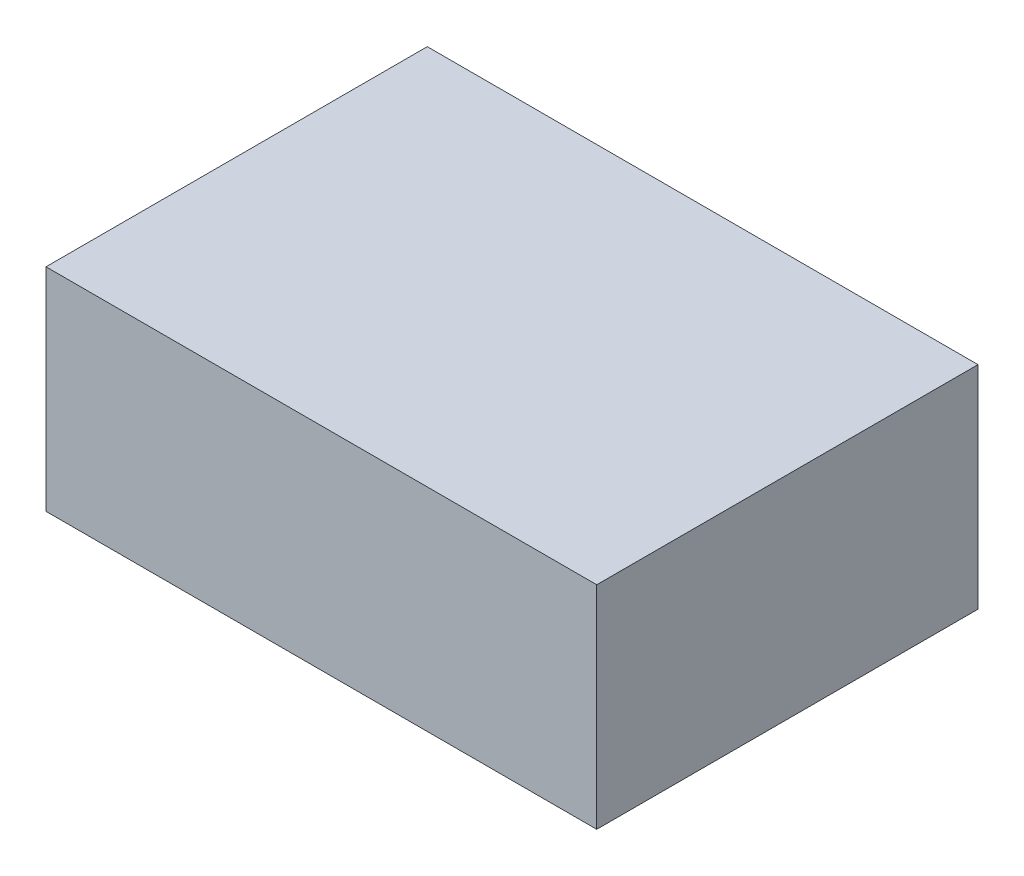
ISO-10303-21;
HEADER;
FILE_DESCRIPTION(('STEP AP214'),'2;1');
FILE_NAME('part.step','',(''),(''),'','','');
FILE_SCHEMA(('AUTOMOTIVE_DESIGN { 1 0 10303 214 1 1 1 1 }'));
ENDSEC;
DATA;
#1=APPLICATION_CONTEXT('core data for automotive mechanical design processes');
#2=APPLICATION_PROTOCOL_DEFINITION('international standard','automotive_design',2000,#1);
#3=PRODUCT_CONTEXT('',#1,'mechanical');
#4=PRODUCT('Part','Part','',(#3));
#5=PRODUCT_RELATED_PRODUCT_CATEGORY('part','',(#4));
#6=PRODUCT_DEFINITION_FORMATION('','',#4);
#7=PRODUCT_DEFINITION_CONTEXT('part definition',#1,'design');
#8=PRODUCT_DEFINITION('design','',#6,#7);
#9=PRODUCT_DEFINITION_SHAPE('','',#8);
#10=(LENGTH_UNIT() NAMED_UNIT(*) SI_UNIT(.MILLI.,.METRE.));
#11=(NAMED_UNIT(*) PLANE_ANGLE_UNIT() SI_UNIT($,.RADIAN.));
#12=(NAMED_UNIT(*) SI_UNIT($,.STERADIAN.) SOLID_ANGLE_UNIT());
#13=UNCERTAINTY_MEASURE_WITH_UNIT(LENGTH_MEASURE(1.E-05),#10,'distance_accuracy_value','');
#14=(GEOMETRIC_REPRESENTATION_CONTEXT(3) GLOBAL_UNCERTAINTY_ASSIGNED_CONTEXT((#13)) GLOBAL_UNIT_ASSIGNED_CONTEXT((#10,
#11,#12)) REPRESENTATION_CONTEXT('',''));
#15=CARTESIAN_POINT('',(0.,0.,0.));
#16=DIRECTION('',(0.,0.,1.));
#17=DIRECTION('',(1.,0.,0.));
#18=AXIS2_PLACEMENT_3D('',#15,#16,#17);
#19=CARTESIAN_POINT('',(-32.5,25.,22.5));
#20=DIRECTION('',(1.,0.,0.));
#21=DIRECTION('',(0.,0.,-1.));
#22=AXIS2_PLACEMENT_3D('',#19,#20,#21);
#23=PLANE('',#22);
#24=DIRECTION('',(0.,0.,1.));
#25=VECTOR('',#24,1.);
#26=CARTESIAN_POINT('',(-32.5,0.,22.5));
#27=LINE('',#26,#25);
#28=CARTESIAN_POINT('',(-32.5,0.,-22.5));
#29=VERTEX_POINT('',#28);
#30=CARTESIAN_POINT('',(-32.5,0.,22.5));
#31=VERTEX_POINT('',#30);
#32=EDGE_CURVE('E103',#29,#31,#27,.T.);
#33=ORIENTED_EDGE('',*,*,#32,.T.);
#34=DIRECTION('',(0.,-1.,0.));
#35=VECTOR('',#34,1.);
#36=CARTESIAN_POINT('',(-32.5,25.,22.5));
#37=LINE('',#36,#35);
#38=CARTESIAN_POINT('',(-32.5,25.,22.5));
#39=VERTEX_POINT('',#38);
#40=EDGE_CURVE('E11',#39,#31,#37,.T.);
#41=ORIENTED_EDGE('',*,*,#40,.F.);
#42=DIRECTION('',(0.,0.,1.));
#43=VECTOR('',#42,1.);
#44=CARTESIAN_POINT('',(-32.5,25.,22.5));
#45=LINE('',#44,#43);
#46=CARTESIAN_POINT('',(-32.5,25.,-22.5));
#47=VERTEX_POINT('',#46);
#48=EDGE_CURVE('E91',#47,#39,#45,.T.);
#49=ORIENTED_EDGE('',*,*,#48,.F.);
#50=DIRECTION('',(0.,-1.,0.));
#51=VECTOR('',#50,1.);
#52=CARTESIAN_POINT('',(-32.5,25.,-22.5));
#53=LINE('',#52,#51);
#54=EDGE_CURVE('E99',#47,#29,#53,.T.);
#55=ORIENTED_EDGE('',*,*,#54,.T.);
#56=EDGE_LOOP('',(#33,#41,#49,#55));
#57=FACE_BOUND('',#56,.T.);
#58=ADVANCED_FACE('F40',(#57),#23,.F.);
#59=CARTESIAN_POINT('',(32.5,25.,22.5));
#60=DIRECTION('',(0.,0.,-1.));
#61=DIRECTION('',(-1.,0.,0.));
#62=AXIS2_PLACEMENT_3D('',#59,#60,#61);
#63=PLANE('',#62);
#64=DIRECTION('',(1.,0.,0.));
#65=VECTOR('',#64,1.);
#66=CARTESIAN_POINT('',(32.5,0.,22.5));
#67=LINE('',#66,#65);
#68=CARTESIAN_POINT('',(32.5,0.,22.5));
#69=VERTEX_POINT('',#68);
#70=EDGE_CURVE('E95',#31,#69,#67,.T.);
#71=ORIENTED_EDGE('',*,*,#70,.T.);
#72=DIRECTION('',(0.,-1.,0.));
#73=VECTOR('',#72,1.);
#74=CARTESIAN_POINT('',(32.5,25.,22.5));
#75=LINE('',#74,#73);
#76=CARTESIAN_POINT('',(32.5,25.,22.5));
#77=VERTEX_POINT('',#76);
#78=EDGE_CURVE('E48',#77,#69,#75,.T.);
#79=ORIENTED_EDGE('',*,*,#78,.F.);
#80=DIRECTION('',(1.,0.,0.));
#81=VECTOR('',#80,1.);
#82=CARTESIAN_POINT('',(32.5,25.,22.5));
#83=LINE('',#82,#81);
#84=EDGE_CURVE('E86',#39,#77,#83,.T.);
#85=ORIENTED_EDGE('',*,*,#84,.F.);
#86=ORIENTED_EDGE('',*,*,#40,.T.);
#87=EDGE_LOOP('',(#71,#79,#85,#86));
#88=FACE_BOUND('',#87,.T.);
#89=ADVANCED_FACE('F94',(#88),#63,.F.);
#90=CARTESIAN_POINT('',(32.5,25.,22.5));
#91=DIRECTION('',(-1.,0.,0.));
#92=DIRECTION('',(0.,0.,1.));
#93=AXIS2_PLACEMENT_3D('',#90,#91,#92);
#94=PLANE('',#93);
#95=DIRECTION('',(0.,0.,-1.));
#96=VECTOR('',#95,1.);
#97=CARTESIAN_POINT('',(32.5,0.,22.5));
#98=LINE('',#97,#96);
#99=CARTESIAN_POINT('',(32.5,0.,-22.5));
#100=VERTEX_POINT('',#99);
#101=EDGE_CURVE('E73',#69,#100,#98,.T.);
#102=ORIENTED_EDGE('',*,*,#101,.T.);
#103=DIRECTION('',(0.,-1.,0.));
#104=VECTOR('',#103,1.);
#105=CARTESIAN_POINT('',(32.5,25.,-22.5));
#106=LINE('',#105,#104);
#107=CARTESIAN_POINT('',(32.5,25.,-22.5));
#108=VERTEX_POINT('',#107);
#109=EDGE_CURVE('E96',#108,#100,#106,.T.);
#110=ORIENTED_EDGE('',*,*,#109,.F.);
#111=DIRECTION('',(0.,0.,-1.));
#112=VECTOR('',#111,1.);
#113=CARTESIAN_POINT('',(32.5,25.,22.5));
#114=LINE('',#113,#112);
#115=EDGE_CURVE('E89',#77,#108,#114,.T.);
#116=ORIENTED_EDGE('',*,*,#115,.F.);
#117=ORIENTED_EDGE('',*,*,#78,.T.);
#118=EDGE_LOOP('',(#102,#110,#116,#117));
#119=FACE_BOUND('',#118,.T.);
#120=ADVANCED_FACE('F97',(#119),#94,.F.);
#121=CARTESIAN_POINT('',(32.5,25.,-22.5));
#122=DIRECTION('',(0.,0.,1.));
#123=DIRECTION('',(1.,0.,0.));
#124=AXIS2_PLACEMENT_3D('',#121,#122,#123);
#125=PLANE('',#124);
#126=DIRECTION('',(-1.,0.,0.));
#127=VECTOR('',#126,1.);
#128=CARTESIAN_POINT('',(32.5,0.,-22.5));
#129=LINE('',#128,#127);
#130=EDGE_CURVE('E79',#100,#29,#129,.T.);
#131=ORIENTED_EDGE('',*,*,#130,.T.);
#132=ORIENTED_EDGE('',*,*,#54,.F.);
#133=DIRECTION('',(-1.,0.,0.));
#134=VECTOR('',#133,1.);
#135=CARTESIAN_POINT('',(32.5,25.,-22.5));
#136=LINE('',#135,#134);
#137=EDGE_CURVE('E56',#108,#47,#136,.T.);
#138=ORIENTED_EDGE('',*,*,#137,.F.);
#139=ORIENTED_EDGE('',*,*,#109,.T.);
#140=EDGE_LOOP('',(#131,#132,#138,#139));
#141=FACE_BOUND('',#140,.T.);
#142=ADVANCED_FACE('F111',(#141),#125,.F.);
#143=CARTESIAN_POINT('',(0.,25.,0.));
#144=DIRECTION('',(0.,1.,0.));
#145=DIRECTION('',(0.,0.,1.));
#146=AXIS2_PLACEMENT_3D('',#143,#144,#145);
#147=PLANE('',#146);
#148=ORIENTED_EDGE('',*,*,#48,.T.);
#149=ORIENTED_EDGE('',*,*,#84,.T.);
#150=ORIENTED_EDGE('',*,*,#115,.T.);
#151=ORIENTED_EDGE('',*,*,#137,.T.);
#152=EDGE_LOOP('',(#148,#149,#150,#151));
#153=FACE_BOUND('',#152,.T.);
#154=ADVANCED_FACE('F87',(#153),#147,.T.);
#155=CARTESIAN_POINT('',(0.,0.,0.));
#156=DIRECTION('',(0.,1.,0.));
#157=DIRECTION('',(0.,0.,1.));
#158=AXIS2_PLACEMENT_3D('',#155,#156,#157);
#159=PLANE('',#158);
#160=CARTESIAN_POINT('',(29.5,0.,13.5));
#161=DIRECTION('',(0.,-1.,0.));
#162=DIRECTION('',(0.,0.,-1.));
#163=AXIS2_PLACEMENT_3D('',#160,#161,#162);
#164=CIRCLE('',#163,1.5);
#165=CARTESIAN_POINT('',(29.5,0.,12.));
#166=VERTEX_POINT('',#165);
#167=EDGE_CURVE('E120',#166,#166,#164,.T.);
#168=ORIENTED_EDGE('',*,*,#167,.F.);
#169=EDGE_LOOP('',(#168));
#170=FACE_BOUND('',#169,.T.);
#171=CARTESIAN_POINT('',(-29.5,0.,-13.5));
#172=DIRECTION('',(0.,-1.,0.));
#173=DIRECTION('',(0.,0.,-1.));
#174=AXIS2_PLACEMENT_3D('',#171,#172,#173);
#175=CIRCLE('',#174,1.5);
#176=CARTESIAN_POINT('',(-29.5,0.,-15.));
#177=VERTEX_POINT('',#176);
#178=EDGE_CURVE('E126',#177,#177,#175,.T.);
#179=ORIENTED_EDGE('',*,*,#178,.F.);
#180=EDGE_LOOP('',(#179));
#181=FACE_BOUND('',#180,.T.);
#182=CARTESIAN_POINT('',(29.5,0.,-13.5));
#183=DIRECTION('',(0.,-1.,0.));
#184=DIRECTION('',(0.,0.,-1.));
#185=AXIS2_PLACEMENT_3D('',#182,#183,#184);
#186=CIRCLE('',#185,1.5);
#187=CARTESIAN_POINT('',(29.5,0.,-15.));
#188=VERTEX_POINT('',#187);
#189=EDGE_CURVE('E127',#188,#188,#186,.T.);
#190=ORIENTED_EDGE('',*,*,#189,.F.);
#191=EDGE_LOOP('',(#190));
#192=FACE_BOUND('',#191,.T.);
#193=CARTESIAN_POINT('',(-29.5,0.,13.5));
#194=DIRECTION('',(0.,-1.,0.));
#195=DIRECTION('',(0.,0.,-1.));
#196=AXIS2_PLACEMENT_3D('',#193,#194,#195);
#197=CIRCLE('',#196,1.5);
#198=CARTESIAN_POINT('',(-29.5,0.,12.));
#199=VERTEX_POINT('',#198);
#200=EDGE_CURVE('E117',#199,#199,#197,.T.);
#201=ORIENTED_EDGE('',*,*,#200,.F.);
#202=EDGE_LOOP('',(#201));
#203=FACE_BOUND('',#202,.T.);
#204=ORIENTED_EDGE('',*,*,#32,.F.);
#205=ORIENTED_EDGE('',*,*,#130,.F.);
#206=ORIENTED_EDGE('',*,*,#101,.F.);
#207=ORIENTED_EDGE('',*,*,#70,.F.);
#208=EDGE_LOOP('',(#204,#205,#206,#207));
#209=FACE_BOUND('',#208,.T.);
#210=ADVANCED_FACE('F114',(#170,#181,#192,#203,#209),#159,.F.);
#211=CARTESIAN_POINT('',(-29.5,10.,13.5));
#212=DIRECTION('',(0.,-1.,0.));
#213=DIRECTION('',(0.,0.,-1.));
#214=AXIS2_PLACEMENT_3D('',#211,#212,#213);
#215=CYLINDRICAL_SURFACE('',#214,1.5);
#216=CARTESIAN_POINT('',(-29.5,10.,13.5));
#217=DIRECTION('',(0.,-1.,0.));
#218=DIRECTION('',(0.,0.,-1.));
#219=AXIS2_PLACEMENT_3D('',#216,#217,#218);
#220=CIRCLE('',#219,1.5);
#221=CARTESIAN_POINT('',(-29.5,10.,12.));
#222=VERTEX_POINT('',#221);
#223=EDGE_CURVE('E106',#222,#222,#220,.T.);
#224=ORIENTED_EDGE('',*,*,#223,.F.);
#225=EDGE_LOOP('',(#224));
#226=FACE_BOUND('',#225,.T.);
#227=ORIENTED_EDGE('',*,*,#200,.T.);
#228=EDGE_LOOP('',(#227));
#229=FACE_BOUND('',#228,.T.);
#230=ADVANCED_FACE('F145',(#226,#229),#215,.F.);
#231=CARTESIAN_POINT('',(-29.5,10.,13.5));
#232=DIRECTION('',(0.,-1.,0.));
#233=DIRECTION('',(0.,0.,-1.));
#234=AXIS2_PLACEMENT_3D('',#231,#232,#233);
#235=PLANE('',#234);
#236=ORIENTED_EDGE('',*,*,#223,.T.);
#237=EDGE_LOOP('',(#236));
#238=FACE_BOUND('',#237,.T.);
#239=ADVANCED_FACE('F151',(#238),#235,.T.);
#240=CARTESIAN_POINT('',(29.5,10.,-13.5));
#241=DIRECTION('',(0.,-1.,0.));
#242=DIRECTION('',(0.,0.,-1.));
#243=AXIS2_PLACEMENT_3D('',#240,#241,#242);
#244=CYLINDRICAL_SURFACE('',#243,1.5);
#245=CARTESIAN_POINT('',(29.5,10.,-13.5));
#246=DIRECTION('',(0.,-1.,0.));
#247=DIRECTION('',(0.,0.,-1.));
#248=AXIS2_PLACEMENT_3D('',#245,#246,#247);
#249=CIRCLE('',#248,1.5);
#250=CARTESIAN_POINT('',(29.5,10.,-15.));
#251=VERTEX_POINT('',#250);
#252=EDGE_CURVE('E135',#251,#251,#249,.T.);
#253=ORIENTED_EDGE('',*,*,#252,.F.);
#254=EDGE_LOOP('',(#253));
#255=FACE_BOUND('',#254,.T.);
#256=ORIENTED_EDGE('',*,*,#189,.T.);
#257=EDGE_LOOP('',(#256));
#258=FACE_BOUND('',#257,.T.);
#259=ADVANCED_FACE('F141',(#255,#258),#244,.F.);
#260=CARTESIAN_POINT('',(29.5,10.,-13.5));
#261=DIRECTION('',(0.,-1.,0.));
#262=DIRECTION('',(0.,0.,-1.));
#263=AXIS2_PLACEMENT_3D('',#260,#261,#262);
#264=PLANE('',#263);
#265=ORIENTED_EDGE('',*,*,#252,.T.);
#266=EDGE_LOOP('',(#265));
#267=FACE_BOUND('',#266,.T.);
#268=ADVANCED_FACE('F202',(#267),#264,.T.);
#269=CARTESIAN_POINT('',(-29.5,10.,-13.5));
#270=DIRECTION('',(0.,-1.,0.));
#271=DIRECTION('',(0.,0.,-1.));
#272=AXIS2_PLACEMENT_3D('',#269,#270,#271);
#273=CYLINDRICAL_SURFACE('',#272,1.5);
#274=CARTESIAN_POINT('',(-29.5,10.,-13.5));
#275=DIRECTION('',(0.,-1.,0.));
#276=DIRECTION('',(0.,0.,-1.));
#277=AXIS2_PLACEMENT_3D('',#274,#275,#276);
#278=CIRCLE('',#277,1.5);
#279=CARTESIAN_POINT('',(-29.5,10.,-15.));
#280=VERTEX_POINT('',#279);
#281=EDGE_CURVE('E123',#280,#280,#278,.T.);
#282=ORIENTED_EDGE('',*,*,#281,.F.);
#283=EDGE_LOOP('',(#282));
#284=FACE_BOUND('',#283,.T.);
#285=ORIENTED_EDGE('',*,*,#178,.T.);
#286=EDGE_LOOP('',(#285));
#287=FACE_BOUND('',#286,.T.);
#288=ADVANCED_FACE('F213',(#284,#287),#273,.F.);
#289=CARTESIAN_POINT('',(-29.5,10.,-13.5));
#290=DIRECTION('',(0.,-1.,0.));
#291=DIRECTION('',(0.,0.,-1.));
#292=AXIS2_PLACEMENT_3D('',#289,#290,#291);
#293=PLANE('',#292);
#294=ORIENTED_EDGE('',*,*,#281,.T.);
#295=EDGE_LOOP('',(#294));
#296=FACE_BOUND('',#295,.T.);
#297=ADVANCED_FACE('F224',(#296),#293,.T.);
#298=CARTESIAN_POINT('',(29.5,10.,13.5));
#299=DIRECTION('',(0.,-1.,0.));
#300=DIRECTION('',(0.,0.,-1.));
#301=AXIS2_PLACEMENT_3D('',#298,#299,#300);
#302=CYLINDRICAL_SURFACE('',#301,1.5);
#303=CARTESIAN_POINT('',(29.5,10.,13.5));
#304=DIRECTION('',(0.,-1.,0.));
#305=DIRECTION('',(0.,0.,-1.));
#306=AXIS2_PLACEMENT_3D('',#303,#304,#305);
#307=CIRCLE('',#306,1.5);
#308=CARTESIAN_POINT('',(29.5,10.,12.));
#309=VERTEX_POINT('',#308);
#310=EDGE_CURVE('E130',#309,#309,#307,.T.);
#311=ORIENTED_EDGE('',*,*,#310,.F.);
#312=EDGE_LOOP('',(#311));
#313=FACE_BOUND('',#312,.T.);
#314=ORIENTED_EDGE('',*,*,#167,.T.);
#315=EDGE_LOOP('',(#314));
#316=FACE_BOUND('',#315,.T.);
#317=ADVANCED_FACE('F235',(#313,#316),#302,.F.);
#318=CARTESIAN_POINT('',(29.5,10.,13.5));
#319=DIRECTION('',(0.,-1.,0.));
#320=DIRECTION('',(0.,0.,-1.));
#321=AXIS2_PLACEMENT_3D('',#318,#319,#320);
#322=PLANE('',#321);
#323=ORIENTED_EDGE('',*,*,#310,.T.);
#324=EDGE_LOOP('',(#323));
#325=FACE_BOUND('',#324,.T.);
#326=ADVANCED_FACE('F246',(#325),#322,.T.);
#327=CLOSED_SHELL('',(#58,#89,#120,#142,#154,#210,#230,#239,#259,#268,#288,#297,#317,#326));
#328=MANIFOLD_SOLID_BREP('B2',#327);
#329=ADVANCED_BREP_SHAPE_REPRESENTATION('',(#18,#328),#14);
#330=SHAPE_DEFINITION_REPRESENTATION(#9,#329);
ENDSEC;
END-ISO-10303-21;
